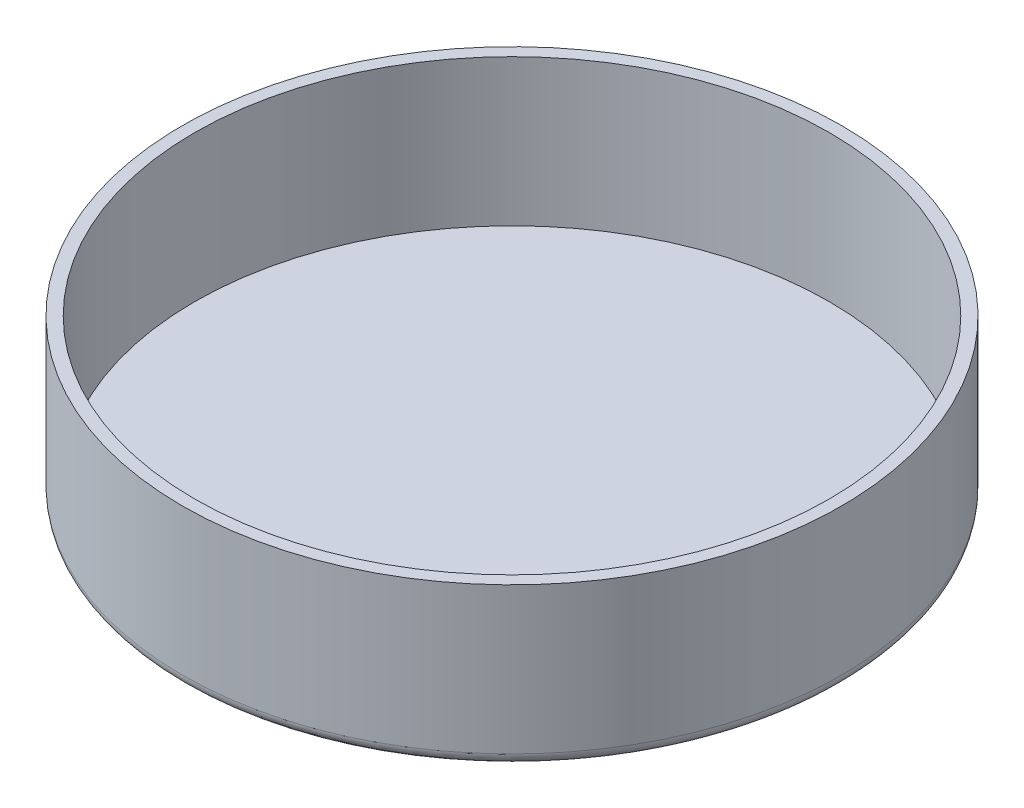
ISO-10303-21;
HEADER;
FILE_DESCRIPTION(('STEP AP214'),'2;1');
FILE_NAME('part.step','',(''),(''),'','','');
FILE_SCHEMA(('AUTOMOTIVE_DESIGN { 1 0 10303 214 1 1 1 1 }'));
ENDSEC;
DATA;
#1=APPLICATION_CONTEXT('core data for automotive mechanical design processes');
#2=APPLICATION_PROTOCOL_DEFINITION('international standard','automotive_design',2000,#1);
#3=PRODUCT_CONTEXT('',#1,'mechanical');
#4=PRODUCT('Part','Part','',(#3));
#5=PRODUCT_RELATED_PRODUCT_CATEGORY('part','',(#4));
#6=PRODUCT_DEFINITION_FORMATION('','',#4);
#7=PRODUCT_DEFINITION_CONTEXT('part definition',#1,'design');
#8=PRODUCT_DEFINITION('design','',#6,#7);
#9=PRODUCT_DEFINITION_SHAPE('','',#8);
#10=(LENGTH_UNIT() NAMED_UNIT(*) SI_UNIT(.MILLI.,.METRE.));
#11=(NAMED_UNIT(*) PLANE_ANGLE_UNIT() SI_UNIT($,.RADIAN.));
#12=(NAMED_UNIT(*) SI_UNIT($,.STERADIAN.) SOLID_ANGLE_UNIT());
#13=UNCERTAINTY_MEASURE_WITH_UNIT(LENGTH_MEASURE(1.E-05),#10,'distance_accuracy_value','');
#14=(GEOMETRIC_REPRESENTATION_CONTEXT(3) GLOBAL_UNCERTAINTY_ASSIGNED_CONTEXT((#13)) GLOBAL_UNIT_ASSIGNED_CONTEXT((#10,
#11,#12)) REPRESENTATION_CONTEXT('',''));
#15=CARTESIAN_POINT('',(0.,0.,0.));
#16=DIRECTION('',(0.,0.,1.));
#17=DIRECTION('',(1.,0.,0.));
#18=AXIS2_PLACEMENT_3D('',#15,#16,#17);
#19=CARTESIAN_POINT('',(0.,12.,0.));
#20=DIRECTION('',(0.,1.,0.));
#21=DIRECTION('',(0.,0.,1.));
#22=AXIS2_PLACEMENT_3D('',#19,#20,#21);
#23=PLANE('',#22);
#24=CARTESIAN_POINT('',(0.,12.,0.));
#25=DIRECTION('',(0.,1.,0.));
#26=DIRECTION('',(0.,0.,1.));
#27=AXIS2_PLACEMENT_3D('',#24,#25,#26);
#28=CIRCLE('',#27,27.);
#29=CARTESIAN_POINT('',(0.,12.,27.));
#30=VERTEX_POINT('',#29);
#31=EDGE_CURVE('E53',#30,#30,#28,.T.);
#32=ORIENTED_EDGE('',*,*,#31,.T.);
#33=EDGE_LOOP('',(#32));
#34=FACE_BOUND('',#33,.T.);
#35=CARTESIAN_POINT('',(0.,12.,0.));
#36=DIRECTION('',(0.,1.,0.));
#37=DIRECTION('',(0.,0.,1.));
#38=AXIS2_PLACEMENT_3D('',#35,#36,#37);
#39=CIRCLE('',#38,26.);
#40=CARTESIAN_POINT('',(0.,12.,26.));
#41=VERTEX_POINT('',#40);
#42=EDGE_CURVE('E56',#41,#41,#39,.T.);
#43=ORIENTED_EDGE('',*,*,#42,.F.);
#44=EDGE_LOOP('',(#43));
#45=FACE_BOUND('',#44,.T.);
#46=ADVANCED_FACE('F30',(#34,#45),#23,.T.);
#47=CARTESIAN_POINT('',(0.,12.,0.));
#48=DIRECTION('',(0.,-1.,0.));
#49=DIRECTION('',(0.,0.,-1.));
#50=AXIS2_PLACEMENT_3D('',#47,#48,#49);
#51=CYLINDRICAL_SURFACE('',#50,27.);
#52=CARTESIAN_POINT('',(0.,0.,0.));
#53=DIRECTION('',(0.,-1.,0.));
#54=DIRECTION('',(0.,0.,-1.));
#55=AXIS2_PLACEMENT_3D('',#52,#53,#54);
#56=CIRCLE('',#55,27.);
#57=CARTESIAN_POINT('',(0.,0.,-27.));
#58=VERTEX_POINT('',#57);
#59=EDGE_CURVE('E42',#58,#58,#56,.F.);
#60=ORIENTED_EDGE('',*,*,#59,.T.);
#61=EDGE_LOOP('',(#60));
#62=FACE_BOUND('',#61,.T.);
#63=ORIENTED_EDGE('',*,*,#31,.F.);
#64=EDGE_LOOP('',(#63));
#65=FACE_BOUND('',#64,.T.);
#66=ADVANCED_FACE('F83',(#62,#65),#51,.T.);
#67=CARTESIAN_POINT('',(0.,12.,0.));
#68=DIRECTION('',(0.,-1.,0.));
#69=DIRECTION('',(0.,0.,-1.));
#70=AXIS2_PLACEMENT_3D('',#67,#68,#69);
#71=CYLINDRICAL_SURFACE('',#70,26.);
#72=ORIENTED_EDGE('',*,*,#42,.T.);
#73=EDGE_LOOP('',(#72));
#74=FACE_BOUND('',#73,.T.);
#75=CARTESIAN_POINT('',(0.,0.,0.));
#76=DIRECTION('',(0.,1.,0.));
#77=DIRECTION('',(0.,0.,1.));
#78=AXIS2_PLACEMENT_3D('',#75,#76,#77);
#79=CIRCLE('',#78,26.);
#80=CARTESIAN_POINT('',(0.,0.,26.));
#81=VERTEX_POINT('',#80);
#82=EDGE_CURVE('E57',#81,#81,#79,.T.);
#83=ORIENTED_EDGE('',*,*,#82,.F.);
#84=EDGE_LOOP('',(#83));
#85=FACE_BOUND('',#84,.T.);
#86=ADVANCED_FACE('F89',(#74,#85),#71,.F.);
#87=CARTESIAN_POINT('',(0.,0.,0.));
#88=DIRECTION('',(0.,-1.,0.));
#89=DIRECTION('',(0.,0.,-1.));
#90=AXIS2_PLACEMENT_3D('',#87,#88,#89);
#91=PLANE('',#90);
#92=ORIENTED_EDGE('',*,*,#82,.T.);
#93=EDGE_LOOP('',(#92));
#94=FACE_BOUND('',#93,.T.);
#95=ADVANCED_FACE('F96',(#94),#91,.F.);
#96=CARTESIAN_POINT('',(0.,-1.,0.));
#97=DIRECTION('',(0.,-1.,0.));
#98=DIRECTION('',(0.,0.,-1.));
#99=AXIS2_PLACEMENT_3D('',#96,#97,#98);
#100=PLANE('',#99);
#101=CARTESIAN_POINT('',(0.,-1.,0.));
#102=DIRECTION('',(0.,-1.,0.));
#103=DIRECTION('',(0.,0.,-1.));
#104=AXIS2_PLACEMENT_3D('',#101,#102,#103);
#105=CIRCLE('',#104,26.);
#106=CARTESIAN_POINT('',(0.,-1.,-26.));
#107=VERTEX_POINT('',#106);
#108=EDGE_CURVE('E47',#107,#107,#105,.T.);
#109=ORIENTED_EDGE('',*,*,#108,.T.);
#110=EDGE_LOOP('',(#109));
#111=FACE_BOUND('',#110,.T.);
#112=CARTESIAN_POINT('',(0.,-1.,0.));
#113=DIRECTION('',(0.,-1.,0.));
#114=DIRECTION('',(0.,0.,-1.));
#115=AXIS2_PLACEMENT_3D('',#112,#113,#114);
#116=CIRCLE('',#115,25.5);
#117=CARTESIAN_POINT('',(0.,-1.,-25.5));
#118=VERTEX_POINT('',#117);
#119=EDGE_CURVE('E60',#118,#118,#116,.T.);
#120=ORIENTED_EDGE('',*,*,#119,.F.);
#121=EDGE_LOOP('',(#120));
#122=FACE_BOUND('',#121,.T.);
#123=ADVANCED_FACE('F100',(#111,#122),#100,.T.);
#124=CARTESIAN_POINT('',(0.,-1.6,0.));
#125=DIRECTION('',(0.,1.,0.));
#126=DIRECTION('',(0.,0.,1.));
#127=AXIS2_PLACEMENT_3D('',#124,#125,#126);
#128=CYLINDRICAL_SURFACE('',#127,25.5);
#129=CARTESIAN_POINT('',(0.,-1.1,0.));
#130=DIRECTION('',(0.,-1.,0.));
#131=DIRECTION('',(0.,0.,-1.));
#132=AXIS2_PLACEMENT_3D('',#129,#130,#131);
#133=CIRCLE('',#132,25.5);
#134=CARTESIAN_POINT('',(0.,-1.1,-25.5));
#135=VERTEX_POINT('',#134);
#136=EDGE_CURVE('E10',#135,#135,#133,.F.);
#137=ORIENTED_EDGE('',*,*,#136,.T.);
#138=EDGE_LOOP('',(#137));
#139=FACE_BOUND('',#138,.T.);
#140=ORIENTED_EDGE('',*,*,#119,.T.);
#141=EDGE_LOOP('',(#140));
#142=FACE_BOUND('',#141,.T.);
#143=ADVANCED_FACE('F104',(#139,#142),#128,.T.);
#144=CARTESIAN_POINT('',(0.,-1.6,0.));
#145=DIRECTION('',(0.,1.,0.));
#146=DIRECTION('',(0.,0.,1.));
#147=AXIS2_PLACEMENT_3D('',#144,#145,#146);
#148=CYLINDRICAL_SURFACE('',#147,24.5);
#149=CARTESIAN_POINT('',(0.,-1.1,0.));
#150=DIRECTION('',(0.,-1.,0.));
#151=DIRECTION('',(0.,0.,-1.));
#152=AXIS2_PLACEMENT_3D('',#149,#150,#151);
#153=CIRCLE('',#152,24.5);
#154=CARTESIAN_POINT('',(0.,-1.1,-24.5));
#155=VERTEX_POINT('',#154);
#156=EDGE_CURVE('E38',#155,#155,#153,.T.);
#157=ORIENTED_EDGE('',*,*,#156,.T.);
#158=EDGE_LOOP('',(#157));
#159=FACE_BOUND('',#158,.T.);
#160=CARTESIAN_POINT('',(0.,-1.,0.));
#161=DIRECTION('',(0.,-1.,0.));
#162=DIRECTION('',(0.,0.,-1.));
#163=AXIS2_PLACEMENT_3D('',#160,#161,#162);
#164=CIRCLE('',#163,24.5);
#165=CARTESIAN_POINT('',(0.,-1.,-24.5));
#166=VERTEX_POINT('',#165);
#167=EDGE_CURVE('E50',#166,#166,#164,.F.);
#168=ORIENTED_EDGE('',*,*,#167,.T.);
#169=EDGE_LOOP('',(#168));
#170=FACE_BOUND('',#169,.T.);
#171=ADVANCED_FACE('F108',(#159,#170),#148,.F.);
#172=ORIENTED_EDGE('',*,*,#167,.F.);
#173=EDGE_LOOP('',(#172));
#174=FACE_BOUND('',#173,.T.);
#175=ADVANCED_FACE('F79',(#174),#100,.T.);
#176=CARTESIAN_POINT('',(0.,0.,0.));
#177=DIRECTION('',(0.,-1.,0.));
#178=DIRECTION('',(0.,0.,-1.));
#179=AXIS2_PLACEMENT_3D('',#176,#177,#178);
#180=TOROIDAL_SURFACE('',#179,26.,1.);
#181=ORIENTED_EDGE('',*,*,#59,.F.);
#182=EDGE_LOOP('',(#181));
#183=FACE_BOUND('',#182,.T.);
#184=ORIENTED_EDGE('',*,*,#108,.F.);
#185=EDGE_LOOP('',(#184));
#186=FACE_BOUND('',#185,.T.);
#187=ADVANCED_FACE('F73',(#183,#186),#180,.T.);
#188=CARTESIAN_POINT('',(0.,-1.1,0.));
#189=DIRECTION('',(0.,-1.,0.));
#190=DIRECTION('',(0.,0.,-1.));
#191=AXIS2_PLACEMENT_3D('',#188,#189,#190);
#192=TOROIDAL_SURFACE('',#191,25.,0.5);
#193=ORIENTED_EDGE('',*,*,#136,.F.);
#194=EDGE_LOOP('',(#193));
#195=FACE_BOUND('',#194,.T.);
#196=CARTESIAN_POINT('',(0.,-1.6,0.));
#197=DIRECTION('',(0.,-1.,0.));
#198=DIRECTION('',(0.,0.,-1.));
#199=AXIS2_PLACEMENT_3D('',#196,#197,#198);
#200=CIRCLE('',#199,25.);
#201=CARTESIAN_POINT('',(0.,-1.6,-25.));
#202=VERTEX_POINT('',#201);
#203=EDGE_CURVE('E34',#202,#202,#200,.T.);
#204=ORIENTED_EDGE('',*,*,#203,.F.);
#205=EDGE_LOOP('',(#204));
#206=FACE_BOUND('',#205,.T.);
#207=ADVANCED_FACE('F32',(#195,#206),#192,.T.);
#208=CARTESIAN_POINT('',(0.,-1.1,0.));
#209=DIRECTION('',(0.,-1.,0.));
#210=DIRECTION('',(0.,0.,-1.));
#211=AXIS2_PLACEMENT_3D('',#208,#209,#210);
#212=TOROIDAL_SURFACE('',#211,25.,0.5);
#213=ORIENTED_EDGE('',*,*,#203,.T.);
#214=EDGE_LOOP('',(#213));
#215=FACE_BOUND('',#214,.T.);
#216=ORIENTED_EDGE('',*,*,#156,.F.);
#217=EDGE_LOOP('',(#216));
#218=FACE_BOUND('',#217,.T.);
#219=ADVANCED_FACE('F69',(#215,#218),#212,.T.);
#220=CLOSED_SHELL('',(#46,#66,#86,#95,#123,#143,#171,#175,#187,#207,#219));
#221=MANIFOLD_SOLID_BREP('B2',#220);
#222=ADVANCED_BREP_SHAPE_REPRESENTATION('',(#18,#221),#14);
#223=SHAPE_DEFINITION_REPRESENTATION(#9,#222);
ENDSEC;
END-ISO-10303-21;
